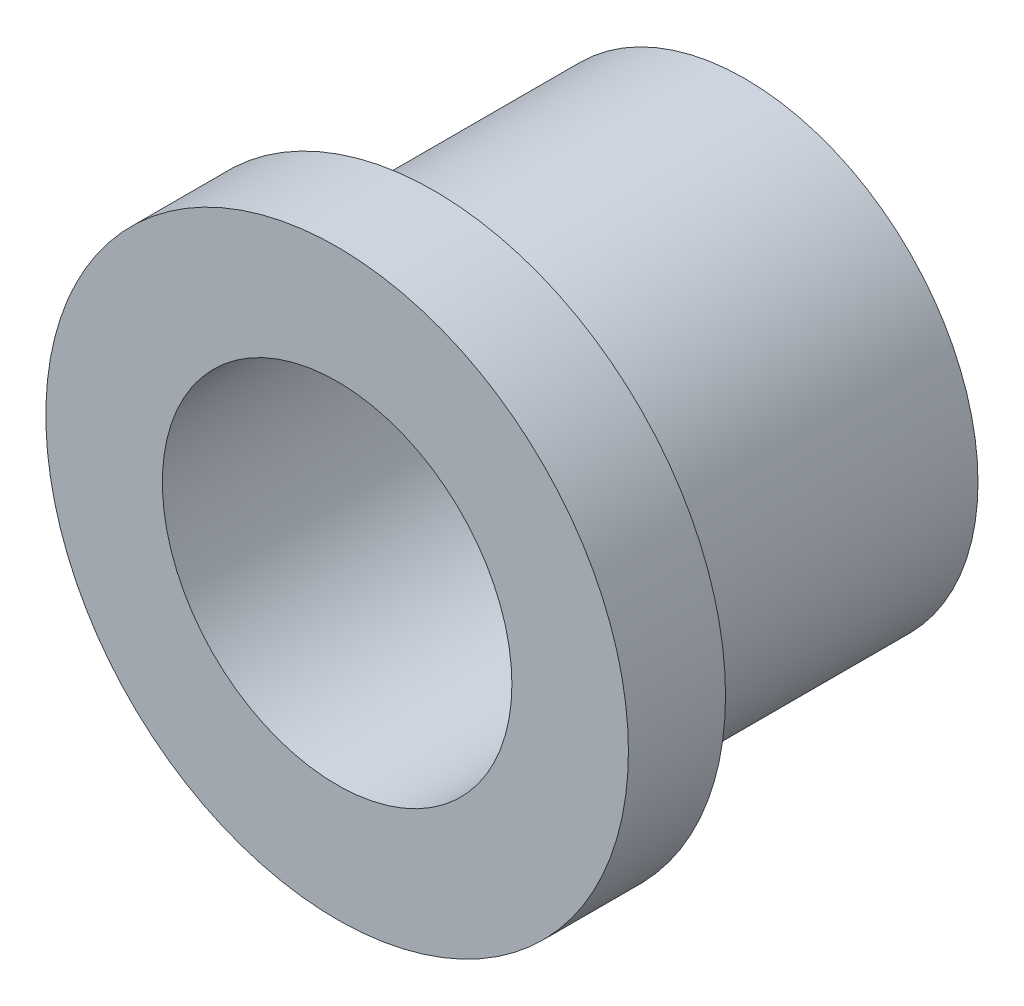
ISO-10303-21;
HEADER;
FILE_DESCRIPTION(('STEP AP214'),'2;1');
FILE_NAME('part.step','',(''),(''),'','','');
FILE_SCHEMA(('AUTOMOTIVE_DESIGN { 1 0 10303 214 1 1 1 1 }'));
ENDSEC;
DATA;
#1=APPLICATION_CONTEXT('core data for automotive mechanical design processes');
#2=APPLICATION_PROTOCOL_DEFINITION('international standard','automotive_design',2000,#1);
#3=PRODUCT_CONTEXT('',#1,'mechanical');
#4=PRODUCT('Part','Part','',(#3));
#5=PRODUCT_RELATED_PRODUCT_CATEGORY('part','',(#4));
#6=PRODUCT_DEFINITION_FORMATION('','',#4);
#7=PRODUCT_DEFINITION_CONTEXT('part definition',#1,'design');
#8=PRODUCT_DEFINITION('design','',#6,#7);
#9=PRODUCT_DEFINITION_SHAPE('','',#8);
#10=(LENGTH_UNIT() NAMED_UNIT(*) SI_UNIT(.MILLI.,.METRE.));
#11=(NAMED_UNIT(*) PLANE_ANGLE_UNIT() SI_UNIT($,.RADIAN.));
#12=(NAMED_UNIT(*) SI_UNIT($,.STERADIAN.) SOLID_ANGLE_UNIT());
#13=UNCERTAINTY_MEASURE_WITH_UNIT(LENGTH_MEASURE(1.E-05),#10,'distance_accuracy_value','');
#14=(GEOMETRIC_REPRESENTATION_CONTEXT(3) GLOBAL_UNCERTAINTY_ASSIGNED_CONTEXT((#13)) GLOBAL_UNIT_ASSIGNED_CONTEXT((#10,
#11,#12)) REPRESENTATION_CONTEXT('',''));
#15=CARTESIAN_POINT('',(0.,0.,0.));
#16=DIRECTION('',(0.,0.,1.));
#17=DIRECTION('',(1.,0.,0.));
#18=AXIS2_PLACEMENT_3D('',#15,#16,#17);
#19=CARTESIAN_POINT('',(0.,0.,-8.));
#20=DIRECTION('',(0.,0.,1.));
#21=DIRECTION('',(1.,0.,0.));
#22=AXIS2_PLACEMENT_3D('',#19,#20,#21);
#23=PLANE('',#22);
#24=CARTESIAN_POINT('',(0.,0.,-8.));
#25=DIRECTION('',(0.,0.,1.));
#26=DIRECTION('',(1.,0.,0.));
#27=AXIS2_PLACEMENT_3D('',#24,#25,#26);
#28=CIRCLE('',#27,12.);
#29=CARTESIAN_POINT('',(12.,0.,-8.));
#30=VERTEX_POINT('',#29);
#31=EDGE_CURVE('E44',#30,#30,#28,.T.);
#32=ORIENTED_EDGE('',*,*,#31,.F.);
#33=EDGE_LOOP('',(#32));
#34=FACE_BOUND('',#33,.T.);
#35=CARTESIAN_POINT('',(0.,0.,-8.));
#36=DIRECTION('',(0.,0.,1.));
#37=DIRECTION('',(1.,0.,0.));
#38=AXIS2_PLACEMENT_3D('',#35,#36,#37);
#39=CIRCLE('',#38,9.);
#40=CARTESIAN_POINT('',(9.,0.,-8.));
#41=VERTEX_POINT('',#40);
#42=EDGE_CURVE('E51',#41,#41,#39,.T.);
#43=ORIENTED_EDGE('',*,*,#42,.T.);
#44=EDGE_LOOP('',(#43));
#45=FACE_BOUND('',#44,.T.);
#46=ADVANCED_FACE('F40',(#34,#45),#23,.F.);
#47=CARTESIAN_POINT('',(0.,0.,8.));
#48=DIRECTION('',(0.,0.,-1.));
#49=DIRECTION('',(-1.,0.,0.));
#50=AXIS2_PLACEMENT_3D('',#47,#48,#49);
#51=CYLINDRICAL_SURFACE('',#50,12.);
#52=CARTESIAN_POINT('',(0.,0.,8.));
#53=DIRECTION('',(0.,0.,1.));
#54=DIRECTION('',(1.,0.,0.));
#55=AXIS2_PLACEMENT_3D('',#52,#53,#54);
#56=CIRCLE('',#55,12.);
#57=CARTESIAN_POINT('',(12.,0.,8.));
#58=VERTEX_POINT('',#57);
#59=EDGE_CURVE('E10',#58,#58,#56,.T.);
#60=ORIENTED_EDGE('',*,*,#59,.F.);
#61=EDGE_LOOP('',(#60));
#62=FACE_BOUND('',#61,.T.);
#63=ORIENTED_EDGE('',*,*,#31,.T.);
#64=EDGE_LOOP('',(#63));
#65=FACE_BOUND('',#64,.T.);
#66=ADVANCED_FACE('F42',(#62,#65),#51,.T.);
#67=CARTESIAN_POINT('',(0.,0.,8.));
#68=DIRECTION('',(0.,0.,-1.));
#69=DIRECTION('',(-1.,0.,0.));
#70=AXIS2_PLACEMENT_3D('',#67,#68,#69);
#71=CYLINDRICAL_SURFACE('',#70,9.);
#72=ORIENTED_EDGE('',*,*,#42,.F.);
#73=EDGE_LOOP('',(#72));
#74=FACE_BOUND('',#73,.T.);
#75=CARTESIAN_POINT('',(0.,0.,13.));
#76=DIRECTION('',(0.,0.,1.));
#77=DIRECTION('',(1.,0.,0.));
#78=AXIS2_PLACEMENT_3D('',#75,#76,#77);
#79=CIRCLE('',#78,9.);
#80=CARTESIAN_POINT('',(9.,0.,13.));
#81=VERTEX_POINT('',#80);
#82=EDGE_CURVE('E59',#81,#81,#79,.T.);
#83=ORIENTED_EDGE('',*,*,#82,.T.);
#84=EDGE_LOOP('',(#83));
#85=FACE_BOUND('',#84,.T.);
#86=ADVANCED_FACE('F65',(#74,#85),#71,.F.);
#87=CARTESIAN_POINT('',(0.,0.,13.));
#88=DIRECTION('',(0.,0.,1.));
#89=DIRECTION('',(1.,0.,0.));
#90=AXIS2_PLACEMENT_3D('',#87,#88,#89);
#91=PLANE('',#90);
#92=CARTESIAN_POINT('',(0.,0.,13.));
#93=DIRECTION('',(0.,0.,1.));
#94=DIRECTION('',(1.,0.,0.));
#95=AXIS2_PLACEMENT_3D('',#92,#93,#94);
#96=CIRCLE('',#95,15.);
#97=CARTESIAN_POINT('',(15.,0.,13.));
#98=VERTEX_POINT('',#97);
#99=EDGE_CURVE('E55',#98,#98,#96,.T.);
#100=ORIENTED_EDGE('',*,*,#99,.T.);
#101=EDGE_LOOP('',(#100));
#102=FACE_BOUND('',#101,.T.);
#103=ORIENTED_EDGE('',*,*,#82,.F.);
#104=EDGE_LOOP('',(#103));
#105=FACE_BOUND('',#104,.T.);
#106=ADVANCED_FACE('F67',(#102,#105),#91,.T.);
#107=CARTESIAN_POINT('',(0.,0.,8.));
#108=DIRECTION('',(0.,0.,1.));
#109=DIRECTION('',(1.,0.,0.));
#110=AXIS2_PLACEMENT_3D('',#107,#108,#109);
#111=PLANE('',#110);
#112=ORIENTED_EDGE('',*,*,#59,.T.);
#113=EDGE_LOOP('',(#112));
#114=FACE_BOUND('',#113,.T.);
#115=CARTESIAN_POINT('',(0.,0.,8.));
#116=DIRECTION('',(0.,0.,1.));
#117=DIRECTION('',(1.,0.,0.));
#118=AXIS2_PLACEMENT_3D('',#115,#116,#117);
#119=CIRCLE('',#118,15.);
#120=CARTESIAN_POINT('',(15.,0.,8.));
#121=VERTEX_POINT('',#120);
#122=EDGE_CURVE('E56',#121,#121,#119,.T.);
#123=ORIENTED_EDGE('',*,*,#122,.F.);
#124=EDGE_LOOP('',(#123));
#125=FACE_BOUND('',#124,.T.);
#126=ADVANCED_FACE('F69',(#114,#125),#111,.F.);
#127=CARTESIAN_POINT('',(0.,0.,13.));
#128=DIRECTION('',(0.,0.,-1.));
#129=DIRECTION('',(-1.,0.,0.));
#130=AXIS2_PLACEMENT_3D('',#127,#128,#129);
#131=CYLINDRICAL_SURFACE('',#130,15.);
#132=ORIENTED_EDGE('',*,*,#99,.F.);
#133=EDGE_LOOP('',(#132));
#134=FACE_BOUND('',#133,.T.);
#135=ORIENTED_EDGE('',*,*,#122,.T.);
#136=EDGE_LOOP('',(#135));
#137=FACE_BOUND('',#136,.T.);
#138=ADVANCED_FACE('F76',(#134,#137),#131,.T.);
#139=CLOSED_SHELL('',(#46,#66,#86,#106,#126,#138));
#140=MANIFOLD_SOLID_BREP('B2',#139);
#141=ADVANCED_BREP_SHAPE_REPRESENTATION('',(#18,#140),#14);
#142=SHAPE_DEFINITION_REPRESENTATION(#9,#141);
ENDSEC;
END-ISO-10303-21;
